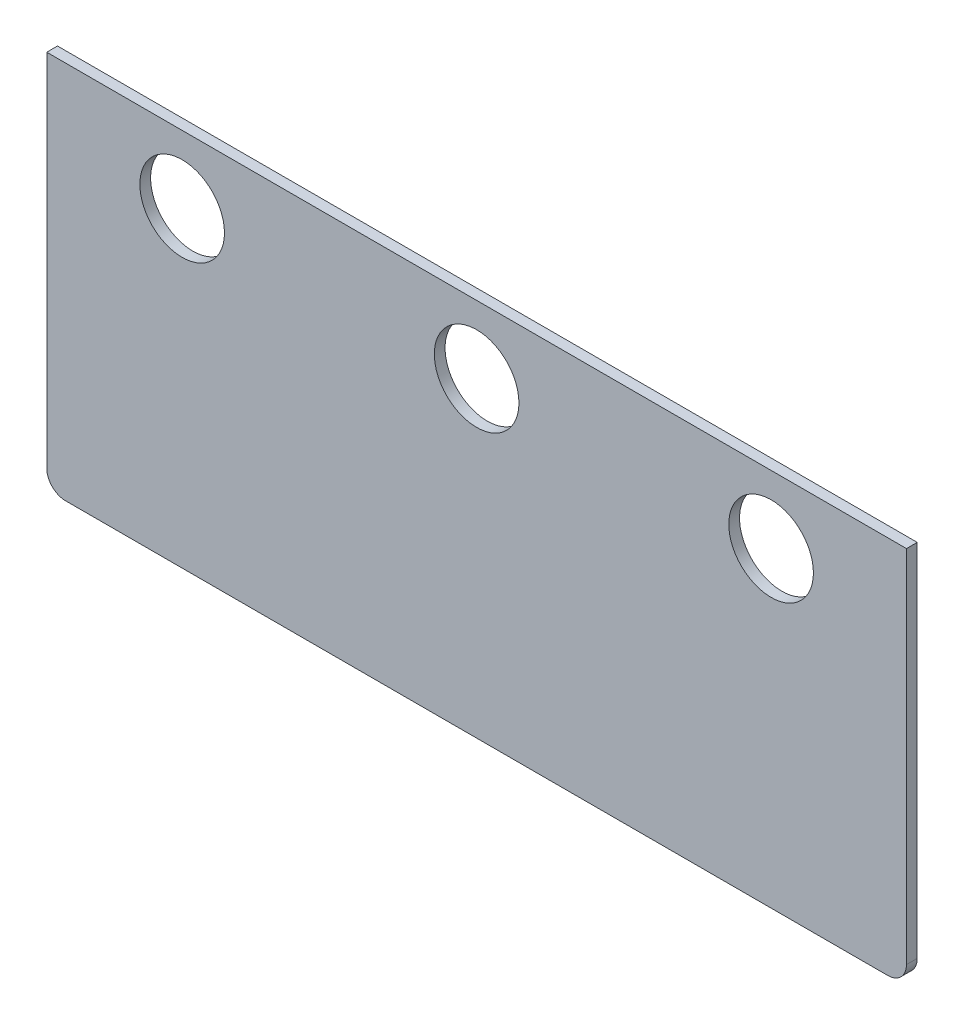
ISO-10303-21;
HEADER;
FILE_DESCRIPTION(('STEP AP214'),'2;1');
FILE_NAME('part.step','',(''),(''),'','','');
FILE_SCHEMA(('AUTOMOTIVE_DESIGN { 1 0 10303 214 1 1 1 1 }'));
ENDSEC;
DATA;
#1=APPLICATION_CONTEXT('core data for automotive mechanical design processes');
#2=APPLICATION_PROTOCOL_DEFINITION('international standard','automotive_design',2000,#1);
#3=PRODUCT_CONTEXT('',#1,'mechanical');
#4=PRODUCT('Part','Part','',(#3));
#5=PRODUCT_RELATED_PRODUCT_CATEGORY('part','',(#4));
#6=PRODUCT_DEFINITION_FORMATION('','',#4);
#7=PRODUCT_DEFINITION_CONTEXT('part definition',#1,'design');
#8=PRODUCT_DEFINITION('design','',#6,#7);
#9=PRODUCT_DEFINITION_SHAPE('','',#8);
#10=(LENGTH_UNIT() NAMED_UNIT(*) SI_UNIT(.MILLI.,.METRE.));
#11=(NAMED_UNIT(*) PLANE_ANGLE_UNIT() SI_UNIT($,.RADIAN.));
#12=(NAMED_UNIT(*) SI_UNIT($,.STERADIAN.) SOLID_ANGLE_UNIT());
#13=UNCERTAINTY_MEASURE_WITH_UNIT(LENGTH_MEASURE(1.E-05),#10,'distance_accuracy_value','');
#14=(GEOMETRIC_REPRESENTATION_CONTEXT(3) GLOBAL_UNCERTAINTY_ASSIGNED_CONTEXT((#13)) GLOBAL_UNIT_ASSIGNED_CONTEXT((#10,
#11,#12)) REPRESENTATION_CONTEXT('',''));
#15=CARTESIAN_POINT('',(0.,0.,0.));
#16=DIRECTION('',(0.,0.,1.));
#17=DIRECTION('',(1.,0.,0.));
#18=AXIS2_PLACEMENT_3D('',#15,#16,#17);
#19=CARTESIAN_POINT('',(0.,0.,3.175));
#20=DIRECTION('',(0.,0.,1.));
#21=DIRECTION('',(1.,0.,0.));
#22=AXIS2_PLACEMENT_3D('',#19,#20,#21);
#23=PLANE('',#22);
#24=CARTESIAN_POINT('',(0.,92.,3.175));
#25=DIRECTION('',(0.,0.,1.));
#26=DIRECTION('',(1.,0.,0.));
#27=AXIS2_PLACEMENT_3D('',#24,#25,#26);
#28=CIRCLE('',#27,12.5);
#29=CARTESIAN_POINT('',(12.5,92.,3.175));
#30=VERTEX_POINT('',#29);
#31=EDGE_CURVE('E152',#30,#30,#28,.T.);
#32=ORIENTED_EDGE('',*,*,#31,.F.);
#33=EDGE_LOOP('',(#32));
#34=FACE_BOUND('',#33,.T.);
#35=DIRECTION('',(1.,0.,0.));
#36=VECTOR('',#35,1.);
#37=CARTESIAN_POINT('',(-127.,0.,3.175));
#38=LINE('',#37,#36);
#39=CARTESIAN_POINT('',(-121.44375,0.,3.175));
#40=VERTEX_POINT('',#39);
#41=CARTESIAN_POINT('',(121.44375,0.,3.175));
#42=VERTEX_POINT('',#41);
#43=EDGE_CURVE('E95',#40,#42,#38,.T.);
#44=ORIENTED_EDGE('',*,*,#43,.T.);
#45=CARTESIAN_POINT('',(121.44375,5.55625,3.175));
#46=DIRECTION('',(0.,0.,1.));
#47=DIRECTION('',(1.,0.,0.));
#48=AXIS2_PLACEMENT_3D('',#45,#46,#47);
#49=CIRCLE('',#48,5.55625);
#50=CARTESIAN_POINT('',(127.,5.55625000000001,3.175));
#51=VERTEX_POINT('',#50);
#52=EDGE_CURVE('E43',#42,#51,#49,.T.);
#53=ORIENTED_EDGE('',*,*,#52,.T.);
#54=DIRECTION('',(0.,1.,0.));
#55=VECTOR('',#54,1.);
#56=CARTESIAN_POINT('',(127.,0.,3.175));
#57=LINE('',#56,#55);
#58=CARTESIAN_POINT('',(127.,112.,3.175));
#59=VERTEX_POINT('',#58);
#60=EDGE_CURVE('E101',#51,#59,#57,.T.);
#61=ORIENTED_EDGE('',*,*,#60,.T.);
#62=DIRECTION('',(-1.,0.,0.));
#63=VECTOR('',#62,1.);
#64=CARTESIAN_POINT('',(127.,112.,3.175));
#65=LINE('',#64,#63);
#66=CARTESIAN_POINT('',(-127.,112.,3.175));
#67=VERTEX_POINT('',#66);
#68=EDGE_CURVE('E96',#59,#67,#65,.T.);
#69=ORIENTED_EDGE('',*,*,#68,.T.);
#70=DIRECTION('',(0.,-1.,0.));
#71=VECTOR('',#70,1.);
#72=CARTESIAN_POINT('',(-127.,112.,3.175));
#73=LINE('',#72,#71);
#74=CARTESIAN_POINT('',(-127.,5.55625,3.175));
#75=VERTEX_POINT('',#74);
#76=EDGE_CURVE('E87',#67,#75,#73,.T.);
#77=ORIENTED_EDGE('',*,*,#76,.T.);
#78=CARTESIAN_POINT('',(-121.44375,5.55625,3.175));
#79=DIRECTION('',(0.,0.,1.));
#80=DIRECTION('',(1.,0.,0.));
#81=AXIS2_PLACEMENT_3D('',#78,#79,#80);
#82=CIRCLE('',#81,5.55625);
#83=EDGE_CURVE('E126',#75,#40,#82,.T.);
#84=ORIENTED_EDGE('',*,*,#83,.T.);
#85=EDGE_LOOP('',(#44,#53,#61,#69,#77,#84));
#86=FACE_BOUND('',#85,.T.);
#87=CARTESIAN_POINT('',(87.,92.,3.175));
#88=DIRECTION('',(0.,0.,1.));
#89=DIRECTION('',(1.,0.,0.));
#90=AXIS2_PLACEMENT_3D('',#87,#88,#89);
#91=CIRCLE('',#90,12.5);
#92=CARTESIAN_POINT('',(99.5000000000001,92.,3.175));
#93=VERTEX_POINT('',#92);
#94=EDGE_CURVE('E146',#93,#93,#91,.T.);
#95=ORIENTED_EDGE('',*,*,#94,.F.);
#96=EDGE_LOOP('',(#95));
#97=FACE_BOUND('',#96,.T.);
#98=CARTESIAN_POINT('',(-87.,92.,3.175));
#99=DIRECTION('',(0.,0.,1.));
#100=DIRECTION('',(1.,0.,0.));
#101=AXIS2_PLACEMENT_3D('',#98,#99,#100);
#102=CIRCLE('',#101,12.5);
#103=CARTESIAN_POINT('',(-74.5,92.,3.175));
#104=VERTEX_POINT('',#103);
#105=EDGE_CURVE('E158',#104,#104,#102,.T.);
#106=ORIENTED_EDGE('',*,*,#105,.F.);
#107=EDGE_LOOP('',(#106));
#108=FACE_BOUND('',#107,.T.);
#109=ADVANCED_FACE('F35',(#34,#86,#97,#108),#23,.T.);
#110=CARTESIAN_POINT('',(0.,0.,0.));
#111=DIRECTION('',(0.,0.,1.));
#112=DIRECTION('',(1.,0.,0.));
#113=AXIS2_PLACEMENT_3D('',#110,#111,#112);
#114=PLANE('',#113);
#115=DIRECTION('',(0.,1.,0.));
#116=VECTOR('',#115,1.);
#117=CARTESIAN_POINT('',(127.,0.,0.));
#118=LINE('',#117,#116);
#119=CARTESIAN_POINT('',(127.,5.55625000000001,0.));
#120=VERTEX_POINT('',#119);
#121=CARTESIAN_POINT('',(127.,112.,0.));
#122=VERTEX_POINT('',#121);
#123=EDGE_CURVE('E105',#120,#122,#118,.T.);
#124=ORIENTED_EDGE('',*,*,#123,.F.);
#125=CARTESIAN_POINT('',(121.44375,5.55625,0.));
#126=DIRECTION('',(0.,0.,1.));
#127=DIRECTION('',(1.,0.,0.));
#128=AXIS2_PLACEMENT_3D('',#125,#126,#127);
#129=CIRCLE('',#128,5.55625);
#130=CARTESIAN_POINT('',(121.44375,0.,0.));
#131=VERTEX_POINT('',#130);
#132=EDGE_CURVE('E120',#120,#131,#129,.F.);
#133=ORIENTED_EDGE('',*,*,#132,.T.);
#134=DIRECTION('',(1.,0.,0.));
#135=VECTOR('',#134,1.);
#136=CARTESIAN_POINT('',(-127.,0.,0.));
#137=LINE('',#136,#135);
#138=CARTESIAN_POINT('',(-121.44375,0.,0.));
#139=VERTEX_POINT('',#138);
#140=EDGE_CURVE('E139',#139,#131,#137,.T.);
#141=ORIENTED_EDGE('',*,*,#140,.F.);
#142=CARTESIAN_POINT('',(-121.44375,5.55625,0.));
#143=DIRECTION('',(0.,0.,1.));
#144=DIRECTION('',(1.,0.,0.));
#145=AXIS2_PLACEMENT_3D('',#142,#143,#144);
#146=CIRCLE('',#145,5.55625);
#147=CARTESIAN_POINT('',(-127.,5.55625,0.));
#148=VERTEX_POINT('',#147);
#149=EDGE_CURVE('E114',#139,#148,#146,.F.);
#150=ORIENTED_EDGE('',*,*,#149,.T.);
#151=DIRECTION('',(0.,-1.,0.));
#152=VECTOR('',#151,1.);
#153=CARTESIAN_POINT('',(-127.,112.,0.));
#154=LINE('',#153,#152);
#155=CARTESIAN_POINT('',(-127.,112.,0.));
#156=VERTEX_POINT('',#155);
#157=EDGE_CURVE('E142',#156,#148,#154,.T.);
#158=ORIENTED_EDGE('',*,*,#157,.F.);
#159=DIRECTION('',(-1.,0.,0.));
#160=VECTOR('',#159,1.);
#161=CARTESIAN_POINT('',(127.,112.,0.));
#162=LINE('',#161,#160);
#163=EDGE_CURVE('E109',#122,#156,#162,.T.);
#164=ORIENTED_EDGE('',*,*,#163,.F.);
#165=EDGE_LOOP('',(#124,#133,#141,#150,#158,#164));
#166=FACE_BOUND('',#165,.T.);
#167=CARTESIAN_POINT('',(87.,92.,0.));
#168=DIRECTION('',(0.,0.,1.));
#169=DIRECTION('',(1.,0.,0.));
#170=AXIS2_PLACEMENT_3D('',#167,#168,#169);
#171=CIRCLE('',#170,12.5);
#172=CARTESIAN_POINT('',(99.5000000000001,92.,0.));
#173=VERTEX_POINT('',#172);
#174=EDGE_CURVE('E149',#173,#173,#171,.T.);
#175=ORIENTED_EDGE('',*,*,#174,.T.);
#176=EDGE_LOOP('',(#175));
#177=FACE_BOUND('',#176,.T.);
#178=CARTESIAN_POINT('',(0.,92.,0.));
#179=DIRECTION('',(0.,0.,1.));
#180=DIRECTION('',(1.,0.,0.));
#181=AXIS2_PLACEMENT_3D('',#178,#179,#180);
#182=CIRCLE('',#181,12.5);
#183=CARTESIAN_POINT('',(12.5,92.,0.));
#184=VERTEX_POINT('',#183);
#185=EDGE_CURVE('E155',#184,#184,#182,.T.);
#186=ORIENTED_EDGE('',*,*,#185,.T.);
#187=EDGE_LOOP('',(#186));
#188=FACE_BOUND('',#187,.T.);
#189=CARTESIAN_POINT('',(-87.,92.,0.));
#190=DIRECTION('',(0.,0.,1.));
#191=DIRECTION('',(1.,0.,0.));
#192=AXIS2_PLACEMENT_3D('',#189,#190,#191);
#193=CIRCLE('',#192,12.5);
#194=CARTESIAN_POINT('',(-74.5,92.,0.));
#195=VERTEX_POINT('',#194);
#196=EDGE_CURVE('E161',#195,#195,#193,.T.);
#197=ORIENTED_EDGE('',*,*,#196,.T.);
#198=EDGE_LOOP('',(#197));
#199=FACE_BOUND('',#198,.T.);
#200=ADVANCED_FACE('F137',(#166,#177,#188,#199),#114,.F.);
#201=CARTESIAN_POINT('',(127.,112.,3.175));
#202=DIRECTION('',(0.,-1.,0.));
#203=DIRECTION('',(0.,0.,-1.));
#204=AXIS2_PLACEMENT_3D('',#201,#202,#203);
#205=PLANE('',#204);
#206=ORIENTED_EDGE('',*,*,#163,.T.);
#207=DIRECTION('',(0.,0.,-1.));
#208=VECTOR('',#207,1.);
#209=CARTESIAN_POINT('',(-127.,112.,3.175));
#210=LINE('',#209,#208);
#211=EDGE_CURVE('E91',#67,#156,#210,.T.);
#212=ORIENTED_EDGE('',*,*,#211,.F.);
#213=ORIENTED_EDGE('',*,*,#68,.F.);
#214=DIRECTION('',(0.,0.,-1.));
#215=VECTOR('',#214,1.);
#216=CARTESIAN_POINT('',(127.,112.,3.175));
#217=LINE('',#216,#215);
#218=EDGE_CURVE('E111',#59,#122,#217,.T.);
#219=ORIENTED_EDGE('',*,*,#218,.T.);
#220=EDGE_LOOP('',(#206,#212,#213,#219));
#221=FACE_BOUND('',#220,.T.);
#222=ADVANCED_FACE('F107',(#221),#205,.F.);
#223=CARTESIAN_POINT('',(-127.,112.,3.175));
#224=DIRECTION('',(1.,0.,0.));
#225=DIRECTION('',(0.,1.,0.));
#226=AXIS2_PLACEMENT_3D('',#223,#224,#225);
#227=PLANE('',#226);
#228=ORIENTED_EDGE('',*,*,#157,.T.);
#229=DIRECTION('',(0.,0.,-1.));
#230=VECTOR('',#229,1.);
#231=CARTESIAN_POINT('',(-127.,5.55625,3.175));
#232=LINE('',#231,#230);
#233=EDGE_CURVE('E11',#148,#75,#232,.F.);
#234=ORIENTED_EDGE('',*,*,#233,.T.);
#235=ORIENTED_EDGE('',*,*,#76,.F.);
#236=ORIENTED_EDGE('',*,*,#211,.T.);
#237=EDGE_LOOP('',(#228,#234,#235,#236));
#238=FACE_BOUND('',#237,.T.);
#239=ADVANCED_FACE('F89',(#238),#227,.F.);
#240=CARTESIAN_POINT('',(-127.,0.,3.175));
#241=DIRECTION('',(0.,1.,0.));
#242=DIRECTION('',(-1.,0.,0.));
#243=AXIS2_PLACEMENT_3D('',#240,#241,#242);
#244=PLANE('',#243);
#245=ORIENTED_EDGE('',*,*,#140,.T.);
#246=DIRECTION('',(0.,0.,-1.));
#247=VECTOR('',#246,1.);
#248=CARTESIAN_POINT('',(121.44375,0.,3.175));
#249=LINE('',#248,#247);
#250=EDGE_CURVE('E56',#131,#42,#249,.F.);
#251=ORIENTED_EDGE('',*,*,#250,.T.);
#252=ORIENTED_EDGE('',*,*,#43,.F.);
#253=DIRECTION('',(0.,0.,-1.));
#254=VECTOR('',#253,1.);
#255=CARTESIAN_POINT('',(-121.44375,0.,3.175));
#256=LINE('',#255,#254);
#257=EDGE_CURVE('E122',#40,#139,#256,.T.);
#258=ORIENTED_EDGE('',*,*,#257,.T.);
#259=EDGE_LOOP('',(#245,#251,#252,#258));
#260=FACE_BOUND('',#259,.T.);
#261=ADVANCED_FACE('F140',(#260),#244,.F.);
#262=CARTESIAN_POINT('',(127.,0.,3.175));
#263=DIRECTION('',(-1.,0.,0.));
#264=DIRECTION('',(0.,-1.,0.));
#265=AXIS2_PLACEMENT_3D('',#262,#263,#264);
#266=PLANE('',#265);
#267=ORIENTED_EDGE('',*,*,#60,.F.);
#268=DIRECTION('',(0.,0.,-1.));
#269=VECTOR('',#268,1.);
#270=CARTESIAN_POINT('',(127.,5.55625000000001,3.175));
#271=LINE('',#270,#269);
#272=EDGE_CURVE('E110',#51,#120,#271,.T.);
#273=ORIENTED_EDGE('',*,*,#272,.T.);
#274=ORIENTED_EDGE('',*,*,#123,.T.);
#275=ORIENTED_EDGE('',*,*,#218,.F.);
#276=EDGE_LOOP('',(#267,#273,#274,#275));
#277=FACE_BOUND('',#276,.T.);
#278=ADVANCED_FACE('F131',(#277),#266,.F.);
#279=CARTESIAN_POINT('',(87.,92.,3.175));
#280=DIRECTION('',(0.,0.,-1.));
#281=DIRECTION('',(-1.,0.,0.));
#282=AXIS2_PLACEMENT_3D('',#279,#280,#281);
#283=CYLINDRICAL_SURFACE('',#282,12.5);
#284=ORIENTED_EDGE('',*,*,#94,.T.);
#285=EDGE_LOOP('',(#284));
#286=FACE_BOUND('',#285,.T.);
#287=ORIENTED_EDGE('',*,*,#174,.F.);
#288=EDGE_LOOP('',(#287));
#289=FACE_BOUND('',#288,.T.);
#290=ADVANCED_FACE('F179',(#286,#289),#283,.F.);
#291=CARTESIAN_POINT('',(0.,92.,3.175));
#292=DIRECTION('',(0.,0.,-1.));
#293=DIRECTION('',(-1.,0.,0.));
#294=AXIS2_PLACEMENT_3D('',#291,#292,#293);
#295=CYLINDRICAL_SURFACE('',#294,12.5);
#296=ORIENTED_EDGE('',*,*,#31,.T.);
#297=EDGE_LOOP('',(#296));
#298=FACE_BOUND('',#297,.T.);
#299=ORIENTED_EDGE('',*,*,#185,.F.);
#300=EDGE_LOOP('',(#299));
#301=FACE_BOUND('',#300,.T.);
#302=ADVANCED_FACE('F195',(#298,#301),#295,.F.);
#303=CARTESIAN_POINT('',(-87.,92.,3.175));
#304=DIRECTION('',(0.,0.,-1.));
#305=DIRECTION('',(-1.,0.,0.));
#306=AXIS2_PLACEMENT_3D('',#303,#304,#305);
#307=CYLINDRICAL_SURFACE('',#306,12.5);
#308=ORIENTED_EDGE('',*,*,#105,.T.);
#309=EDGE_LOOP('',(#308));
#310=FACE_BOUND('',#309,.T.);
#311=ORIENTED_EDGE('',*,*,#196,.F.);
#312=EDGE_LOOP('',(#311));
#313=FACE_BOUND('',#312,.T.);
#314=ADVANCED_FACE('F167',(#310,#313),#307,.F.);
#315=CARTESIAN_POINT('',(121.44375,5.55625,3.175));
#316=DIRECTION('',(0.,0.,-1.));
#317=DIRECTION('',(-1.,0.,0.));
#318=AXIS2_PLACEMENT_3D('',#315,#316,#317);
#319=CYLINDRICAL_SURFACE('',#318,5.55625);
#320=ORIENTED_EDGE('',*,*,#52,.F.);
#321=ORIENTED_EDGE('',*,*,#250,.F.);
#322=ORIENTED_EDGE('',*,*,#132,.F.);
#323=ORIENTED_EDGE('',*,*,#272,.F.);
#324=EDGE_LOOP('',(#320,#321,#322,#323));
#325=FACE_BOUND('',#324,.T.);
#326=ADVANCED_FACE('F134',(#325),#319,.T.);
#327=CARTESIAN_POINT('',(-121.44375,5.55625,3.175));
#328=DIRECTION('',(0.,0.,-1.));
#329=DIRECTION('',(-1.,0.,0.));
#330=AXIS2_PLACEMENT_3D('',#327,#328,#329);
#331=CYLINDRICAL_SURFACE('',#330,5.55625);
#332=ORIENTED_EDGE('',*,*,#83,.F.);
#333=ORIENTED_EDGE('',*,*,#233,.F.);
#334=ORIENTED_EDGE('',*,*,#149,.F.);
#335=ORIENTED_EDGE('',*,*,#257,.F.);
#336=EDGE_LOOP('',(#332,#333,#334,#335));
#337=FACE_BOUND('',#336,.T.);
#338=ADVANCED_FACE('F37',(#337),#331,.T.);
#339=CLOSED_SHELL('',(#109,#200,#222,#239,#261,#278,#290,#302,#314,#326,#338));
#340=MANIFOLD_SOLID_BREP('B2',#339);
#341=ADVANCED_BREP_SHAPE_REPRESENTATION('',(#18,#340),#14);
#342=SHAPE_DEFINITION_REPRESENTATION(#9,#341);
ENDSEC;
END-ISO-10303-21;
